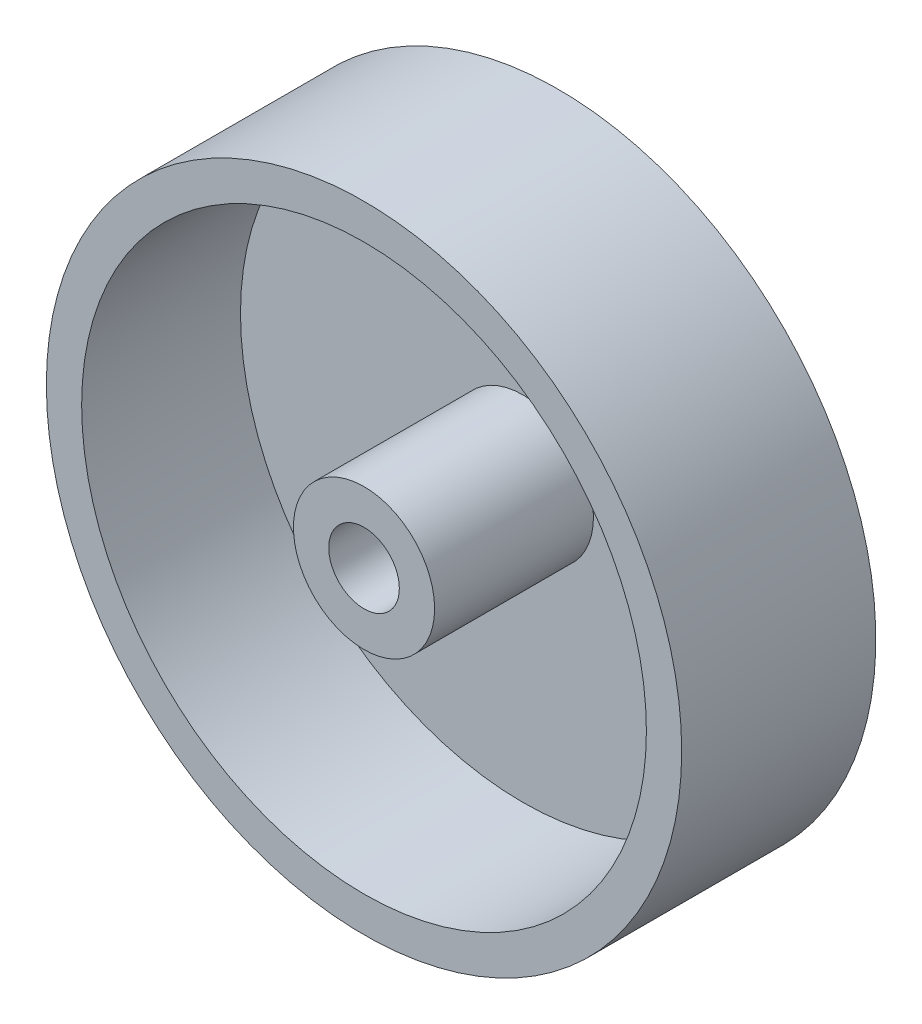
ISO-10303-21;
HEADER;
FILE_DESCRIPTION(('STEP AP214'),'2;1');
FILE_NAME('part.step','',(''),(''),'','','');
FILE_SCHEMA(('AUTOMOTIVE_DESIGN { 1 0 10303 214 1 1 1 1 }'));
ENDSEC;
DATA;
#1=APPLICATION_CONTEXT('core data for automotive mechanical design processes');
#2=APPLICATION_PROTOCOL_DEFINITION('international standard','automotive_design',2000,#1);
#3=PRODUCT_CONTEXT('',#1,'mechanical');
#4=PRODUCT('Part','Part','',(#3));
#5=PRODUCT_RELATED_PRODUCT_CATEGORY('part','',(#4));
#6=PRODUCT_DEFINITION_FORMATION('','',#4);
#7=PRODUCT_DEFINITION_CONTEXT('part definition',#1,'design');
#8=PRODUCT_DEFINITION('design','',#6,#7);
#9=PRODUCT_DEFINITION_SHAPE('','',#8);
#10=(LENGTH_UNIT() NAMED_UNIT(*) SI_UNIT(.MILLI.,.METRE.));
#11=(NAMED_UNIT(*) PLANE_ANGLE_UNIT() SI_UNIT($,.RADIAN.));
#12=(NAMED_UNIT(*) SI_UNIT($,.STERADIAN.) SOLID_ANGLE_UNIT());
#13=UNCERTAINTY_MEASURE_WITH_UNIT(LENGTH_MEASURE(1.E-05),#10,'distance_accuracy_value','');
#14=(GEOMETRIC_REPRESENTATION_CONTEXT(3) GLOBAL_UNCERTAINTY_ASSIGNED_CONTEXT((#13)) GLOBAL_UNIT_ASSIGNED_CONTEXT((#10,
#11,#12)) REPRESENTATION_CONTEXT('',''));
#15=CARTESIAN_POINT('',(0.,0.,0.));
#16=DIRECTION('',(0.,0.,1.));
#17=DIRECTION('',(1.,0.,0.));
#18=AXIS2_PLACEMENT_3D('',#15,#16,#17);
#19=CARTESIAN_POINT('',(0.,0.,-3.3529411764706));
#20=DIRECTION('',(0.,0.,1.));
#21=DIRECTION('',(1.,0.,0.));
#22=AXIS2_PLACEMENT_3D('',#19,#20,#21);
#23=PLANE('',#22);
#24=CARTESIAN_POINT('',(0.,0.,-3.3529411764706));
#25=DIRECTION('',(0.,0.,1.));
#26=DIRECTION('',(1.,0.,0.));
#27=AXIS2_PLACEMENT_3D('',#24,#25,#26);
#28=CIRCLE('',#27,2.);
#29=CARTESIAN_POINT('',(2.,0.,-3.3529411764706));
#30=VERTEX_POINT('',#29);
#31=EDGE_CURVE('E10',#30,#30,#28,.T.);
#32=ORIENTED_EDGE('',*,*,#31,.F.);
#33=EDGE_LOOP('',(#32));
#34=FACE_BOUND('',#33,.T.);
#35=CARTESIAN_POINT('',(0.,0.,-3.3529411764706));
#36=DIRECTION('',(0.,0.,1.));
#37=DIRECTION('',(1.,0.,0.));
#38=AXIS2_PLACEMENT_3D('',#35,#36,#37);
#39=CIRCLE('',#38,4.);
#40=CARTESIAN_POINT('',(4.00000000000001,0.,-3.3529411764706));
#41=VERTEX_POINT('',#40);
#42=EDGE_CURVE('E60',#41,#41,#39,.T.);
#43=ORIENTED_EDGE('',*,*,#42,.T.);
#44=EDGE_LOOP('',(#43));
#45=FACE_BOUND('',#44,.T.);
#46=ADVANCED_FACE('F36',(#34,#45),#23,.T.);
#47=CARTESIAN_POINT('',(0.,0.,-3.3529411764706));
#48=DIRECTION('',(0.,0.,1.));
#49=DIRECTION('',(1.,0.,0.));
#50=AXIS2_PLACEMENT_3D('',#47,#48,#49);
#51=CIRCLE('',#50,16.);
#52=CARTESIAN_POINT('',(16.,0.,-3.3529411764706));
#53=VERTEX_POINT('',#52);
#54=EDGE_CURVE('E61',#53,#53,#51,.T.);
#55=ORIENTED_EDGE('',*,*,#54,.F.);
#56=EDGE_LOOP('',(#55));
#57=FACE_BOUND('',#56,.T.);
#58=CARTESIAN_POINT('',(0.,0.,-3.3529411764706));
#59=DIRECTION('',(0.,0.,1.));
#60=DIRECTION('',(1.,0.,0.));
#61=AXIS2_PLACEMENT_3D('',#58,#59,#60);
#62=CIRCLE('',#61,18.);
#63=CARTESIAN_POINT('',(18.,0.,-3.3529411764706));
#64=VERTEX_POINT('',#63);
#65=EDGE_CURVE('E49',#64,#64,#62,.T.);
#66=ORIENTED_EDGE('',*,*,#65,.T.);
#67=EDGE_LOOP('',(#66));
#68=FACE_BOUND('',#67,.T.);
#69=ADVANCED_FACE('F38',(#57,#68),#23,.T.);
#70=CARTESIAN_POINT('',(0.,0.,-14.3529411764706));
#71=DIRECTION('',(0.,0.,-1.));
#72=DIRECTION('',(-1.,0.,0.));
#73=AXIS2_PLACEMENT_3D('',#70,#71,#72);
#74=PLANE('',#73);
#75=CARTESIAN_POINT('',(0.,0.,-14.3529411764706));
#76=DIRECTION('',(0.,0.,-1.));
#77=DIRECTION('',(-1.,0.,0.));
#78=AXIS2_PLACEMENT_3D('',#75,#76,#77);
#79=CIRCLE('',#78,2.);
#80=CARTESIAN_POINT('',(-2.,0.,-14.3529411764706));
#81=VERTEX_POINT('',#80);
#82=EDGE_CURVE('E44',#81,#81,#79,.T.);
#83=ORIENTED_EDGE('',*,*,#82,.F.);
#84=EDGE_LOOP('',(#83));
#85=FACE_BOUND('',#84,.T.);
#86=CARTESIAN_POINT('',(0.,0.,-14.3529411764706));
#87=DIRECTION('',(0.,0.,-1.));
#88=DIRECTION('',(-1.,0.,0.));
#89=AXIS2_PLACEMENT_3D('',#86,#87,#88);
#90=CIRCLE('',#89,18.);
#91=CARTESIAN_POINT('',(-18.,0.,-14.3529411764706));
#92=VERTEX_POINT('',#91);
#93=EDGE_CURVE('E54',#92,#92,#90,.T.);
#94=ORIENTED_EDGE('',*,*,#93,.T.);
#95=EDGE_LOOP('',(#94));
#96=FACE_BOUND('',#95,.T.);
#97=ADVANCED_FACE('F99',(#85,#96),#74,.T.);
#98=CARTESIAN_POINT('',(0.,0.,-31.3529411764706));
#99=DIRECTION('',(0.,0.,1.));
#100=DIRECTION('',(1.,0.,0.));
#101=AXIS2_PLACEMENT_3D('',#98,#99,#100);
#102=CYLINDRICAL_SURFACE('',#101,2.);
#103=ORIENTED_EDGE('',*,*,#31,.T.);
#104=EDGE_LOOP('',(#103));
#105=FACE_BOUND('',#104,.T.);
#106=ORIENTED_EDGE('',*,*,#82,.T.);
#107=EDGE_LOOP('',(#106));
#108=FACE_BOUND('',#107,.T.);
#109=ADVANCED_FACE('F105',(#105,#108),#102,.F.);
#110=CARTESIAN_POINT('',(0.,0.,5.6470588235294));
#111=DIRECTION('',(0.,0.,-1.));
#112=DIRECTION('',(-1.,0.,0.));
#113=AXIS2_PLACEMENT_3D('',#110,#111,#112);
#114=CYLINDRICAL_SURFACE('',#113,18.);
#115=ORIENTED_EDGE('',*,*,#65,.F.);
#116=EDGE_LOOP('',(#115));
#117=FACE_BOUND('',#116,.T.);
#118=ORIENTED_EDGE('',*,*,#93,.F.);
#119=EDGE_LOOP('',(#118));
#120=FACE_BOUND('',#119,.T.);
#121=ADVANCED_FACE('F91',(#117,#120),#114,.T.);
#122=CARTESIAN_POINT('',(0.,0.,-12.3529411764706));
#123=DIRECTION('',(0.,0.,-1.));
#124=DIRECTION('',(-1.,0.,0.));
#125=AXIS2_PLACEMENT_3D('',#122,#123,#124);
#126=PLANE('',#125);
#127=CARTESIAN_POINT('',(0.,0.,-12.3529411764706));
#128=DIRECTION('',(0.,0.,-1.));
#129=DIRECTION('',(-1.,0.,0.));
#130=AXIS2_PLACEMENT_3D('',#127,#128,#129);
#131=CIRCLE('',#130,4.);
#132=CARTESIAN_POINT('',(-4.,0.,-12.3529411764706));
#133=VERTEX_POINT('',#132);
#134=EDGE_CURVE('E65',#133,#133,#131,.T.);
#135=ORIENTED_EDGE('',*,*,#134,.T.);
#136=EDGE_LOOP('',(#135));
#137=FACE_BOUND('',#136,.T.);
#138=CARTESIAN_POINT('',(0.,0.,-12.3529411764706));
#139=DIRECTION('',(0.,0.,-1.));
#140=DIRECTION('',(-1.,0.,0.));
#141=AXIS2_PLACEMENT_3D('',#138,#139,#140);
#142=CIRCLE('',#141,16.);
#143=CARTESIAN_POINT('',(-16.,0.,-12.3529411764706));
#144=VERTEX_POINT('',#143);
#145=EDGE_CURVE('E66',#144,#144,#142,.T.);
#146=ORIENTED_EDGE('',*,*,#145,.F.);
#147=EDGE_LOOP('',(#146));
#148=FACE_BOUND('',#147,.T.);
#149=ADVANCED_FACE('F77',(#137,#148),#126,.F.);
#150=CARTESIAN_POINT('',(0.,0.,-31.3529411764706));
#151=DIRECTION('',(0.,0.,1.));
#152=DIRECTION('',(1.,0.,0.));
#153=AXIS2_PLACEMENT_3D('',#150,#151,#152);
#154=CYLINDRICAL_SURFACE('',#153,4.);
#155=ORIENTED_EDGE('',*,*,#42,.F.);
#156=EDGE_LOOP('',(#155));
#157=FACE_BOUND('',#156,.T.);
#158=ORIENTED_EDGE('',*,*,#134,.F.);
#159=EDGE_LOOP('',(#158));
#160=FACE_BOUND('',#159,.T.);
#161=ADVANCED_FACE('F80',(#157,#160),#154,.T.);
#162=CARTESIAN_POINT('',(0.,0.,5.6470588235294));
#163=DIRECTION('',(0.,0.,-1.));
#164=DIRECTION('',(-1.,0.,0.));
#165=AXIS2_PLACEMENT_3D('',#162,#163,#164);
#166=CYLINDRICAL_SURFACE('',#165,16.);
#167=ORIENTED_EDGE('',*,*,#54,.T.);
#168=EDGE_LOOP('',(#167));
#169=FACE_BOUND('',#168,.T.);
#170=ORIENTED_EDGE('',*,*,#145,.T.);
#171=EDGE_LOOP('',(#170));
#172=FACE_BOUND('',#171,.T.);
#173=ADVANCED_FACE('F82',(#169,#172),#166,.F.);
#174=CLOSED_SHELL('',(#46,#69,#97,#109,#121,#149,#161,#173));
#175=MANIFOLD_SOLID_BREP('B2',#174);
#176=ADVANCED_BREP_SHAPE_REPRESENTATION('',(#18,#175),#14);
#177=SHAPE_DEFINITION_REPRESENTATION(#9,#176);
ENDSEC;
END-ISO-10303-21;
